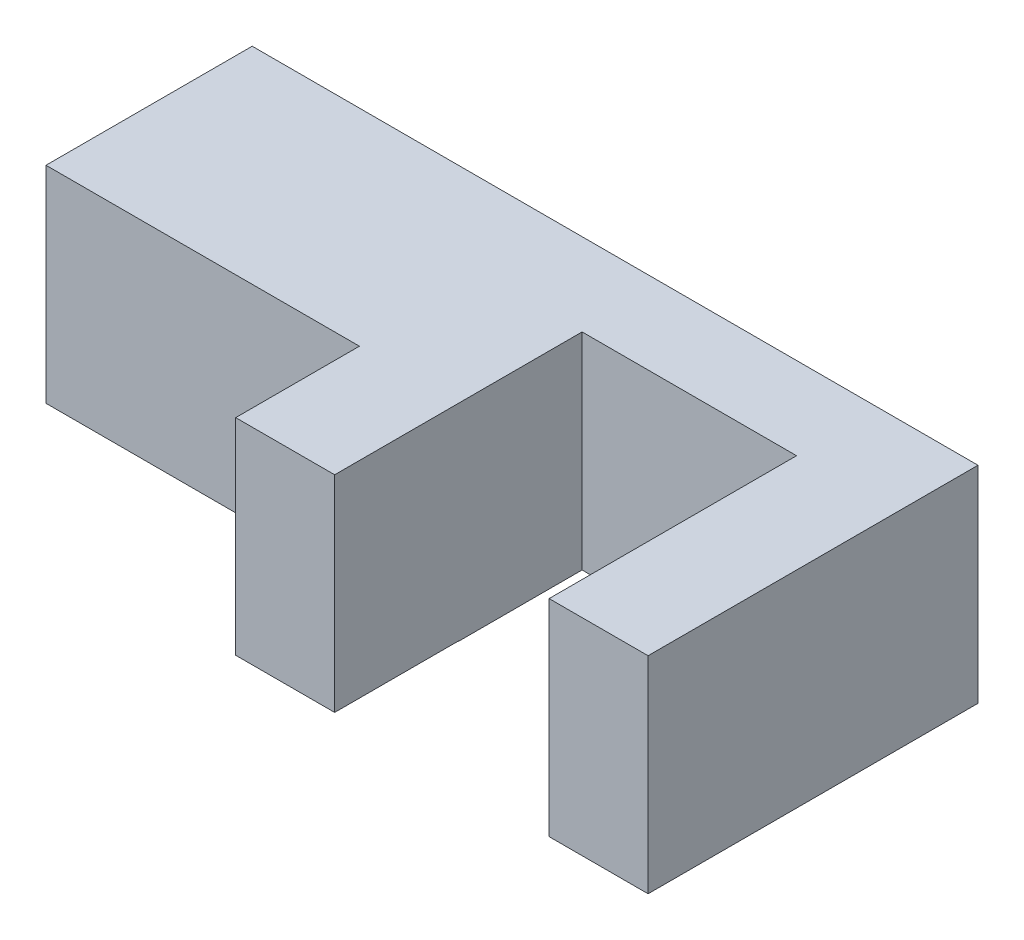
ISO-10303-21;
HEADER;
FILE_DESCRIPTION(('STEP AP214'),'2;1');
FILE_NAME('part.step','',(''),(''),'','','');
FILE_SCHEMA(('AUTOMOTIVE_DESIGN { 1 0 10303 214 1 1 1 1 }'));
ENDSEC;
DATA;
#1=APPLICATION_CONTEXT('core data for automotive mechanical design processes');
#2=APPLICATION_PROTOCOL_DEFINITION('international standard','automotive_design',2000,#1);
#3=PRODUCT_CONTEXT('',#1,'mechanical');
#4=PRODUCT('Part','Part','',(#3));
#5=PRODUCT_RELATED_PRODUCT_CATEGORY('part','',(#4));
#6=PRODUCT_DEFINITION_FORMATION('','',#4);
#7=PRODUCT_DEFINITION_CONTEXT('part definition',#1,'design');
#8=PRODUCT_DEFINITION('design','',#6,#7);
#9=PRODUCT_DEFINITION_SHAPE('','',#8);
#10=(LENGTH_UNIT() NAMED_UNIT(*) SI_UNIT(.MILLI.,.METRE.));
#11=(NAMED_UNIT(*) PLANE_ANGLE_UNIT() SI_UNIT($,.RADIAN.));
#12=(NAMED_UNIT(*) SI_UNIT($,.STERADIAN.) SOLID_ANGLE_UNIT());
#13=UNCERTAINTY_MEASURE_WITH_UNIT(LENGTH_MEASURE(1.E-05),#10,'distance_accuracy_value','');
#14=(GEOMETRIC_REPRESENTATION_CONTEXT(3) GLOBAL_UNCERTAINTY_ASSIGNED_CONTEXT((#13)) GLOBAL_UNIT_ASSIGNED_CONTEXT((#10,
#11,#12)) REPRESENTATION_CONTEXT('',''));
#15=CARTESIAN_POINT('',(0.,0.,0.));
#16=DIRECTION('',(0.,0.,1.));
#17=DIRECTION('',(1.,0.,0.));
#18=AXIS2_PLACEMENT_3D('',#15,#16,#17);
#19=CARTESIAN_POINT('',(54.9,5.,-2.51));
#20=DIRECTION('',(-1.,0.,0.));
#21=DIRECTION('',(0.,0.,1.));
#22=AXIS2_PLACEMENT_3D('',#19,#20,#21);
#23=PLANE('',#22);
#24=DIRECTION('',(0.,0.,-1.));
#25=VECTOR('',#24,1.);
#26=CARTESIAN_POINT('',(54.9,0.,0.));
#27=LINE('',#26,#25);
#28=CARTESIAN_POINT('',(54.9,0.,2.5));
#29=VERTEX_POINT('',#28);
#30=CARTESIAN_POINT('',(54.9,0.,-2.5));
#31=VERTEX_POINT('',#30);
#32=EDGE_CURVE('E133',#29,#31,#27,.T.);
#33=ORIENTED_EDGE('',*,*,#32,.F.);
#34=DIRECTION('',(0.,1.,0.));
#35=VECTOR('',#34,1.);
#36=CARTESIAN_POINT('',(54.9,5.,2.5));
#37=LINE('',#36,#35);
#38=CARTESIAN_POINT('',(54.9,5.,2.5));
#39=VERTEX_POINT('',#38);
#40=EDGE_CURVE('E138',#29,#39,#37,.T.);
#41=ORIENTED_EDGE('',*,*,#40,.T.);
#42=DIRECTION('',(0.,0.,-1.));
#43=VECTOR('',#42,1.);
#44=CARTESIAN_POINT('',(54.9,5.,0.));
#45=LINE('',#44,#43);
#46=CARTESIAN_POINT('',(54.9,5.,-2.5));
#47=VERTEX_POINT('',#46);
#48=EDGE_CURVE('E142',#39,#47,#45,.T.);
#49=ORIENTED_EDGE('',*,*,#48,.T.);
#50=DIRECTION('',(0.,-1.,0.));
#51=VECTOR('',#50,1.);
#52=CARTESIAN_POINT('',(54.9,5.,-2.5));
#53=LINE('',#52,#51);
#54=EDGE_CURVE('E146',#47,#31,#53,.T.);
#55=ORIENTED_EDGE('',*,*,#54,.T.);
#56=EDGE_LOOP('',(#33,#41,#49,#55));
#57=FACE_BOUND('',#56,.T.);
#58=ADVANCED_FACE('F45',(#57),#23,.T.);
#59=CARTESIAN_POINT('',(62.5,5.,2.5));
#60=DIRECTION('',(0.,0.,-1.));
#61=DIRECTION('',(-1.,0.,0.));
#62=AXIS2_PLACEMENT_3D('',#59,#60,#61);
#63=PLANE('',#62);
#64=ORIENTED_EDGE('',*,*,#40,.F.);
#65=DIRECTION('',(1.,0.,0.));
#66=VECTOR('',#65,1.);
#67=CARTESIAN_POINT('',(62.5,0.,2.5));
#68=LINE('',#67,#66);
#69=CARTESIAN_POINT('',(64.9,0.,2.5));
#70=VERTEX_POINT('',#69);
#71=EDGE_CURVE('E49',#29,#70,#68,.T.);
#72=ORIENTED_EDGE('',*,*,#71,.T.);
#73=DIRECTION('',(0.,-1.,0.));
#74=VECTOR('',#73,1.);
#75=CARTESIAN_POINT('',(64.9,5.,2.5));
#76=LINE('',#75,#74);
#77=CARTESIAN_POINT('',(64.9,0.00859696890402346,2.5));
#78=VERTEX_POINT('',#77);
#79=EDGE_CURVE('E189',#78,#70,#76,.T.);
#80=ORIENTED_EDGE('',*,*,#79,.F.);
#81=DIRECTION('',(1.,0.,0.));
#82=VECTOR('',#81,1.);
#83=CARTESIAN_POINT('',(62.5,0.00859696890402346,2.5));
#84=LINE('',#83,#82);
#85=CARTESIAN_POINT('',(62.5,0.00859696890402346,2.5));
#86=VERTEX_POINT('',#85);
#87=EDGE_CURVE('E129',#86,#78,#84,.T.);
#88=ORIENTED_EDGE('',*,*,#87,.F.);
#89=DIRECTION('',(0.,-1.,0.));
#90=VECTOR('',#89,1.);
#91=CARTESIAN_POINT('',(62.5,5.,2.5));
#92=LINE('',#91,#90);
#93=CARTESIAN_POINT('',(62.5,5.,2.5));
#94=VERTEX_POINT('',#93);
#95=EDGE_CURVE('E125',#94,#86,#92,.T.);
#96=ORIENTED_EDGE('',*,*,#95,.F.);
#97=DIRECTION('',(1.,0.,0.));
#98=VECTOR('',#97,1.);
#99=CARTESIAN_POINT('',(62.5,5.,2.5));
#100=LINE('',#99,#98);
#101=EDGE_CURVE('E153',#39,#94,#100,.T.);
#102=ORIENTED_EDGE('',*,*,#101,.F.);
#103=EDGE_LOOP('',(#64,#72,#80,#88,#96,#102));
#104=FACE_BOUND('',#103,.T.);
#105=ADVANCED_FACE('F281',(#104),#63,.F.);
#106=CARTESIAN_POINT('',(0.,5.,0.));
#107=DIRECTION('',(0.,-1.,0.));
#108=DIRECTION('',(0.,0.,-1.));
#109=AXIS2_PLACEMENT_3D('',#106,#107,#108);
#110=PLANE('',#109);
#111=ORIENTED_EDGE('',*,*,#48,.F.);
#112=ORIENTED_EDGE('',*,*,#101,.T.);
#113=DIRECTION('',(0.,0.,-1.));
#114=VECTOR('',#113,1.);
#115=CARTESIAN_POINT('',(62.5,5.,5.5));
#116=LINE('',#115,#114);
#117=CARTESIAN_POINT('',(62.5,5.,5.5));
#118=VERTEX_POINT('',#117);
#119=EDGE_CURVE('E215',#118,#94,#116,.T.);
#120=ORIENTED_EDGE('',*,*,#119,.F.);
#121=DIRECTION('',(-1.,0.,0.));
#122=VECTOR('',#121,1.);
#123=CARTESIAN_POINT('',(62.5,5.,5.5));
#124=LINE('',#123,#122);
#125=CARTESIAN_POINT('',(64.9,5.,5.5));
#126=VERTEX_POINT('',#125);
#127=EDGE_CURVE('E65',#126,#118,#124,.T.);
#128=ORIENTED_EDGE('',*,*,#127,.F.);
#129=DIRECTION('',(0.,0.,1.));
#130=VECTOR('',#129,1.);
#131=CARTESIAN_POINT('',(64.9,5.,-0.5));
#132=LINE('',#131,#130);
#133=CARTESIAN_POINT('',(64.9,5.,-0.5));
#134=VERTEX_POINT('',#133);
#135=EDGE_CURVE('E185',#134,#126,#132,.T.);
#136=ORIENTED_EDGE('',*,*,#135,.F.);
#137=DIRECTION('',(1.,0.,0.));
#138=VECTOR('',#137,1.);
#139=CARTESIAN_POINT('',(64.9,5.,-0.5));
#140=LINE('',#139,#138);
#141=CARTESIAN_POINT('',(70.1,5.,-0.5));
#142=VERTEX_POINT('',#141);
#143=EDGE_CURVE('E192',#134,#142,#140,.T.);
#144=ORIENTED_EDGE('',*,*,#143,.T.);
#145=DIRECTION('',(0.,0.,1.));
#146=VECTOR('',#145,1.);
#147=CARTESIAN_POINT('',(70.1,5.,-0.5));
#148=LINE('',#147,#146);
#149=CARTESIAN_POINT('',(70.1,5.,5.5));
#150=VERTEX_POINT('',#149);
#151=EDGE_CURVE('E109',#142,#150,#148,.T.);
#152=ORIENTED_EDGE('',*,*,#151,.T.);
#153=DIRECTION('',(-1.,0.,0.));
#154=VECTOR('',#153,1.);
#155=CARTESIAN_POINT('',(70.1,5.,5.5));
#156=LINE('',#155,#154);
#157=CARTESIAN_POINT('',(72.5,5.,5.5));
#158=VERTEX_POINT('',#157);
#159=EDGE_CURVE('E123',#158,#150,#156,.T.);
#160=ORIENTED_EDGE('',*,*,#159,.F.);
#161=DIRECTION('',(0.,0.,1.));
#162=VECTOR('',#161,1.);
#163=CARTESIAN_POINT('',(72.5,5.,2.5));
#164=LINE('',#163,#162);
#165=CARTESIAN_POINT('',(72.5,5.,-2.5));
#166=VERTEX_POINT('',#165);
#167=EDGE_CURVE('E164',#166,#158,#164,.T.);
#168=ORIENTED_EDGE('',*,*,#167,.F.);
#169=DIRECTION('',(-1.,0.,0.));
#170=VECTOR('',#169,1.);
#171=CARTESIAN_POINT('',(62.5,5.,-2.5));
#172=LINE('',#171,#170);
#173=EDGE_CURVE('E137',#166,#47,#172,.T.);
#174=ORIENTED_EDGE('',*,*,#173,.T.);
#175=EDGE_LOOP('',(#111,#112,#120,#128,#136,#144,#152,#160,#168,#174));
#176=FACE_BOUND('',#175,.T.);
#177=ADVANCED_FACE('F230',(#176),#110,.F.);
#178=CARTESIAN_POINT('',(0.,0.,0.));
#179=DIRECTION('',(0.,-1.,0.));
#180=DIRECTION('',(0.,0.,-1.));
#181=AXIS2_PLACEMENT_3D('',#178,#179,#180);
#182=PLANE('',#181);
#183=ORIENTED_EDGE('',*,*,#71,.F.);
#184=ORIENTED_EDGE('',*,*,#32,.T.);
#185=DIRECTION('',(-1.,0.,0.));
#186=VECTOR('',#185,1.);
#187=CARTESIAN_POINT('',(62.5,0.,-2.5));
#188=LINE('',#187,#186);
#189=CARTESIAN_POINT('',(72.5,0.,-2.5));
#190=VERTEX_POINT('',#189);
#191=EDGE_CURVE('E155',#190,#31,#188,.T.);
#192=ORIENTED_EDGE('',*,*,#191,.F.);
#193=DIRECTION('',(0.,0.,-1.));
#194=VECTOR('',#193,1.);
#195=CARTESIAN_POINT('',(72.5,0.,2.5));
#196=LINE('',#195,#194);
#197=CARTESIAN_POINT('',(72.5,0.,5.5));
#198=VERTEX_POINT('',#197);
#199=EDGE_CURVE('E90',#198,#190,#196,.T.);
#200=ORIENTED_EDGE('',*,*,#199,.F.);
#201=DIRECTION('',(1.,0.,0.));
#202=VECTOR('',#201,1.);
#203=CARTESIAN_POINT('',(70.1,0.,5.5));
#204=LINE('',#203,#202);
#205=CARTESIAN_POINT('',(70.1,0.,5.5));
#206=VERTEX_POINT('',#205);
#207=EDGE_CURVE('E111',#206,#198,#204,.T.);
#208=ORIENTED_EDGE('',*,*,#207,.F.);
#209=DIRECTION('',(0.,0.,1.));
#210=VECTOR('',#209,1.);
#211=CARTESIAN_POINT('',(70.1,0.,-0.5));
#212=LINE('',#211,#210);
#213=CARTESIAN_POINT('',(70.1,0.,-0.5));
#214=VERTEX_POINT('',#213);
#215=EDGE_CURVE('E97',#214,#206,#212,.T.);
#216=ORIENTED_EDGE('',*,*,#215,.F.);
#217=DIRECTION('',(1.,0.,0.));
#218=VECTOR('',#217,1.);
#219=CARTESIAN_POINT('',(64.9,0.,-0.5));
#220=LINE('',#219,#218);
#221=CARTESIAN_POINT('',(64.9,0.,-0.5));
#222=VERTEX_POINT('',#221);
#223=EDGE_CURVE('E196',#222,#214,#220,.T.);
#224=ORIENTED_EDGE('',*,*,#223,.F.);
#225=DIRECTION('',(0.,0.,1.));
#226=VECTOR('',#225,1.);
#227=CARTESIAN_POINT('',(64.9,0.,-0.5));
#228=LINE('',#227,#226);
#229=EDGE_CURVE('E108',#222,#70,#228,.T.);
#230=ORIENTED_EDGE('',*,*,#229,.T.);
#231=EDGE_LOOP('',(#183,#184,#192,#200,#208,#216,#224,#230));
#232=FACE_BOUND('',#231,.T.);
#233=ADVANCED_FACE('F113',(#232),#182,.T.);
#234=CARTESIAN_POINT('',(62.5,5.,-2.5));
#235=DIRECTION('',(0.,0.,1.));
#236=DIRECTION('',(1.,0.,0.));
#237=AXIS2_PLACEMENT_3D('',#234,#235,#236);
#238=PLANE('',#237);
#239=ORIENTED_EDGE('',*,*,#54,.F.);
#240=ORIENTED_EDGE('',*,*,#173,.F.);
#241=DIRECTION('',(0.,1.,0.));
#242=VECTOR('',#241,1.);
#243=CARTESIAN_POINT('',(72.5,0.,-2.5));
#244=LINE('',#243,#242);
#245=EDGE_CURVE('E170',#190,#166,#244,.T.);
#246=ORIENTED_EDGE('',*,*,#245,.F.);
#247=ORIENTED_EDGE('',*,*,#191,.T.);
#248=EDGE_LOOP('',(#239,#240,#246,#247));
#249=FACE_BOUND('',#248,.T.);
#250=ADVANCED_FACE('F47',(#249),#238,.F.);
#251=CARTESIAN_POINT('',(72.5,0.,0.));
#252=DIRECTION('',(1.,0.,0.));
#253=DIRECTION('',(0.,0.,-1.));
#254=AXIS2_PLACEMENT_3D('',#251,#252,#253);
#255=PLANE('',#254);
#256=ORIENTED_EDGE('',*,*,#199,.T.);
#257=ORIENTED_EDGE('',*,*,#245,.T.);
#258=ORIENTED_EDGE('',*,*,#167,.T.);
#259=DIRECTION('',(0.,1.,0.));
#260=VECTOR('',#259,1.);
#261=CARTESIAN_POINT('',(72.5,5.,5.5));
#262=LINE('',#261,#260);
#263=EDGE_CURVE('E118',#198,#158,#262,.T.);
#264=ORIENTED_EDGE('',*,*,#263,.F.);
#265=EDGE_LOOP('',(#256,#257,#258,#264));
#266=FACE_BOUND('',#265,.T.);
#267=ADVANCED_FACE('F274',(#266),#255,.T.);
#268=CARTESIAN_POINT('',(70.1,5.,-0.5));
#269=DIRECTION('',(-1.,0.,0.));
#270=DIRECTION('',(0.,0.,1.));
#271=AXIS2_PLACEMENT_3D('',#268,#269,#270);
#272=PLANE('',#271);
#273=ORIENTED_EDGE('',*,*,#215,.T.);
#274=DIRECTION('',(0.,-1.,0.));
#275=VECTOR('',#274,1.);
#276=CARTESIAN_POINT('',(70.1,5.,5.5));
#277=LINE('',#276,#275);
#278=EDGE_CURVE('E101',#150,#206,#277,.T.);
#279=ORIENTED_EDGE('',*,*,#278,.F.);
#280=ORIENTED_EDGE('',*,*,#151,.F.);
#281=DIRECTION('',(0.,-1.,0.));
#282=VECTOR('',#281,1.);
#283=CARTESIAN_POINT('',(70.1,5.,-0.5));
#284=LINE('',#283,#282);
#285=EDGE_CURVE('E104',#142,#214,#284,.T.);
#286=ORIENTED_EDGE('',*,*,#285,.T.);
#287=EDGE_LOOP('',(#273,#279,#280,#286));
#288=FACE_BOUND('',#287,.T.);
#289=ADVANCED_FACE('F98',(#288),#272,.T.);
#290=CARTESIAN_POINT('',(64.9,5.,-0.5));
#291=DIRECTION('',(-1.,0.,0.));
#292=DIRECTION('',(0.,0.,1.));
#293=AXIS2_PLACEMENT_3D('',#290,#291,#292);
#294=PLANE('',#293);
#295=ORIENTED_EDGE('',*,*,#135,.T.);
#296=DIRECTION('',(0.,1.,0.));
#297=VECTOR('',#296,1.);
#298=CARTESIAN_POINT('',(64.9,5.,5.5));
#299=LINE('',#298,#297);
#300=CARTESIAN_POINT('',(64.9,0.00859696890402346,5.5));
#301=VERTEX_POINT('',#300);
#302=EDGE_CURVE('E211',#301,#126,#299,.T.);
#303=ORIENTED_EDGE('',*,*,#302,.F.);
#304=DIRECTION('',(0.,0.,-1.));
#305=VECTOR('',#304,1.);
#306=CARTESIAN_POINT('',(64.9,0.00859696890402346,5.5));
#307=LINE('',#306,#305);
#308=EDGE_CURVE('E56',#301,#78,#307,.T.);
#309=ORIENTED_EDGE('',*,*,#308,.T.);
#310=ORIENTED_EDGE('',*,*,#79,.T.);
#311=ORIENTED_EDGE('',*,*,#229,.F.);
#312=DIRECTION('',(0.,-1.,0.));
#313=VECTOR('',#312,1.);
#314=CARTESIAN_POINT('',(64.9,5.,-0.5));
#315=LINE('',#314,#313);
#316=EDGE_CURVE('E188',#134,#222,#315,.T.);
#317=ORIENTED_EDGE('',*,*,#316,.F.);
#318=EDGE_LOOP('',(#295,#303,#309,#310,#311,#317));
#319=FACE_BOUND('',#318,.T.);
#320=ADVANCED_FACE('F253',(#319),#294,.F.);
#321=CARTESIAN_POINT('',(0.,0.,-0.5));
#322=DIRECTION('',(0.,0.,-1.));
#323=DIRECTION('',(-1.,0.,0.));
#324=AXIS2_PLACEMENT_3D('',#321,#322,#323);
#325=PLANE('',#324);
#326=ORIENTED_EDGE('',*,*,#143,.F.);
#327=ORIENTED_EDGE('',*,*,#316,.T.);
#328=ORIENTED_EDGE('',*,*,#223,.T.);
#329=ORIENTED_EDGE('',*,*,#285,.F.);
#330=EDGE_LOOP('',(#326,#327,#328,#329));
#331=FACE_BOUND('',#330,.T.);
#332=ADVANCED_FACE('F295',(#331),#325,.F.);
#333=CARTESIAN_POINT('',(62.5,5.,5.5));
#334=DIRECTION('',(1.,0.,0.));
#335=DIRECTION('',(0.,0.,-1.));
#336=AXIS2_PLACEMENT_3D('',#333,#334,#335);
#337=PLANE('',#336);
#338=ORIENTED_EDGE('',*,*,#95,.T.);
#339=DIRECTION('',(0.,0.,-1.));
#340=VECTOR('',#339,1.);
#341=CARTESIAN_POINT('',(62.5,0.00859696890402346,5.5));
#342=LINE('',#341,#340);
#343=CARTESIAN_POINT('',(62.5,0.00859696890402346,5.5));
#344=VERTEX_POINT('',#343);
#345=EDGE_CURVE('E11',#344,#86,#342,.T.);
#346=ORIENTED_EDGE('',*,*,#345,.F.);
#347=DIRECTION('',(0.,-1.,0.));
#348=VECTOR('',#347,1.);
#349=CARTESIAN_POINT('',(62.5,5.,5.5));
#350=LINE('',#349,#348);
#351=EDGE_CURVE('E204',#118,#344,#350,.T.);
#352=ORIENTED_EDGE('',*,*,#351,.F.);
#353=ORIENTED_EDGE('',*,*,#119,.T.);
#354=EDGE_LOOP('',(#338,#346,#352,#353));
#355=FACE_BOUND('',#354,.T.);
#356=ADVANCED_FACE('F292',(#355),#337,.F.);
#357=CARTESIAN_POINT('',(62.5,0.00859696890402346,5.5));
#358=DIRECTION('',(0.,1.,0.));
#359=DIRECTION('',(0.,0.,1.));
#360=AXIS2_PLACEMENT_3D('',#357,#358,#359);
#361=PLANE('',#360);
#362=ORIENTED_EDGE('',*,*,#87,.T.);
#363=ORIENTED_EDGE('',*,*,#308,.F.);
#364=DIRECTION('',(1.,0.,0.));
#365=VECTOR('',#364,1.);
#366=CARTESIAN_POINT('',(62.5,0.00859696890402346,5.5));
#367=LINE('',#366,#365);
#368=EDGE_CURVE('E207',#344,#301,#367,.T.);
#369=ORIENTED_EDGE('',*,*,#368,.F.);
#370=ORIENTED_EDGE('',*,*,#345,.T.);
#371=EDGE_LOOP('',(#362,#363,#369,#370));
#372=FACE_BOUND('',#371,.T.);
#373=ADVANCED_FACE('F249',(#372),#361,.F.);
#374=CARTESIAN_POINT('',(0.,0.,5.5));
#375=DIRECTION('',(0.,0.,1.));
#376=DIRECTION('',(1.,0.,0.));
#377=AXIS2_PLACEMENT_3D('',#374,#375,#376);
#378=PLANE('',#377);
#379=ORIENTED_EDGE('',*,*,#351,.T.);
#380=ORIENTED_EDGE('',*,*,#368,.T.);
#381=ORIENTED_EDGE('',*,*,#302,.T.);
#382=ORIENTED_EDGE('',*,*,#127,.T.);
#383=EDGE_LOOP('',(#379,#380,#381,#382));
#384=FACE_BOUND('',#383,.T.);
#385=ADVANCED_FACE('F244',(#384),#378,.T.);
#386=CARTESIAN_POINT('',(0.,0.,5.5));
#387=DIRECTION('',(0.,0.,1.));
#388=DIRECTION('',(1.,0.,0.));
#389=AXIS2_PLACEMENT_3D('',#386,#387,#388);
#390=PLANE('',#389);
#391=ORIENTED_EDGE('',*,*,#278,.T.);
#392=ORIENTED_EDGE('',*,*,#207,.T.);
#393=ORIENTED_EDGE('',*,*,#263,.T.);
#394=ORIENTED_EDGE('',*,*,#159,.T.);
#395=EDGE_LOOP('',(#391,#392,#393,#394));
#396=FACE_BOUND('',#395,.T.);
#397=ADVANCED_FACE('F121',(#396),#390,.T.);
#398=CLOSED_SHELL('',(#58,#105,#177,#233,#250,#267,#289,#320,#332,#356,#373,#385,#397));
#399=MANIFOLD_SOLID_BREP('B2',#398);
#400=ADVANCED_BREP_SHAPE_REPRESENTATION('',(#18,#399),#14);
#401=SHAPE_DEFINITION_REPRESENTATION(#9,#400);
ENDSEC;
END-ISO-10303-21;
